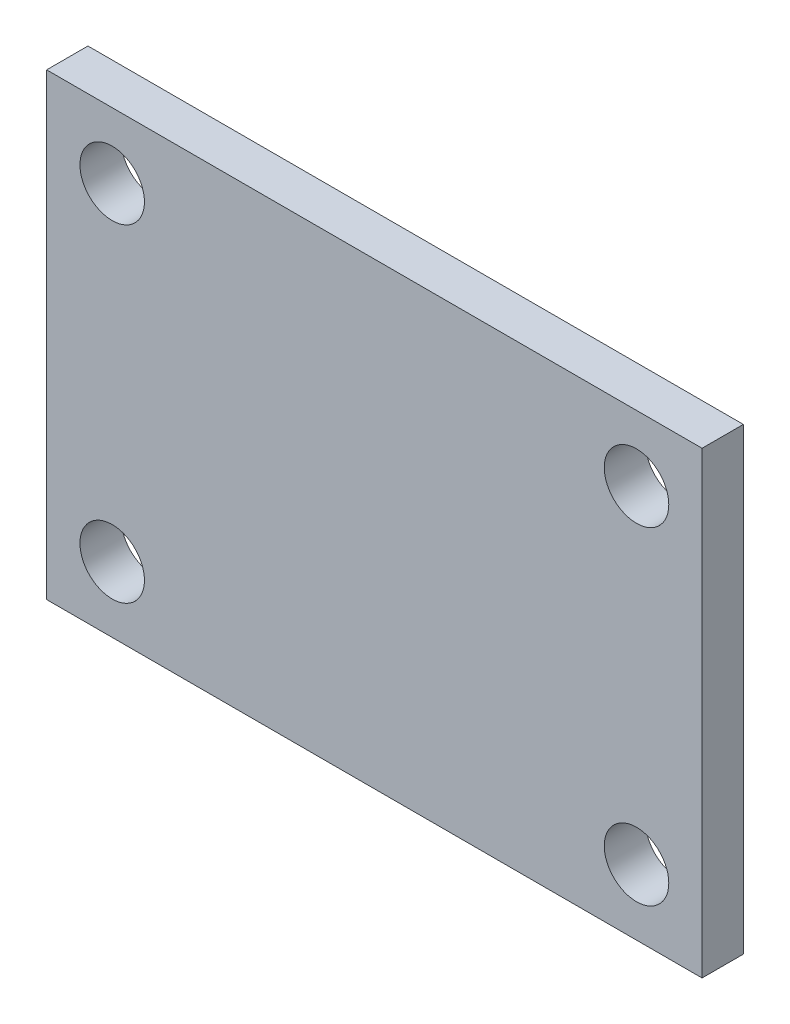
ISO-10303-21;
HEADER;
FILE_DESCRIPTION(('STEP AP214'),'2;1');
FILE_NAME('part.step','',(''),(''),'','','');
FILE_SCHEMA(('AUTOMOTIVE_DESIGN { 1 0 10303 214 1 1 1 1 }'));
ENDSEC;
DATA;
#1=APPLICATION_CONTEXT('core data for automotive mechanical design processes');
#2=APPLICATION_PROTOCOL_DEFINITION('international standard','automotive_design',2000,#1);
#3=PRODUCT_CONTEXT('',#1,'mechanical');
#4=PRODUCT('Part','Part','',(#3));
#5=PRODUCT_RELATED_PRODUCT_CATEGORY('part','',(#4));
#6=PRODUCT_DEFINITION_FORMATION('','',#4);
#7=PRODUCT_DEFINITION_CONTEXT('part definition',#1,'design');
#8=PRODUCT_DEFINITION('design','',#6,#7);
#9=PRODUCT_DEFINITION_SHAPE('','',#8);
#10=(LENGTH_UNIT() NAMED_UNIT(*) SI_UNIT(.MILLI.,.METRE.));
#11=(NAMED_UNIT(*) PLANE_ANGLE_UNIT() SI_UNIT($,.RADIAN.));
#12=(NAMED_UNIT(*) SI_UNIT($,.STERADIAN.) SOLID_ANGLE_UNIT());
#13=UNCERTAINTY_MEASURE_WITH_UNIT(LENGTH_MEASURE(1.E-05),#10,'distance_accuracy_value','');
#14=(GEOMETRIC_REPRESENTATION_CONTEXT(3) GLOBAL_UNCERTAINTY_ASSIGNED_CONTEXT((#13)) GLOBAL_UNIT_ASSIGNED_CONTEXT((#10,
#11,#12)) REPRESENTATION_CONTEXT('',''));
#15=CARTESIAN_POINT('',(0.,0.,0.));
#16=DIRECTION('',(0.,0.,1.));
#17=DIRECTION('',(1.,0.,0.));
#18=AXIS2_PLACEMENT_3D('',#15,#16,#17);
#19=CARTESIAN_POINT('',(0.,0.,-22.55));
#20=DIRECTION('',(0.,0.,-1.));
#21=DIRECTION('',(-1.,0.,0.));
#22=AXIS2_PLACEMENT_3D('',#19,#20,#21);
#23=PLANE('',#22);
#24=DIRECTION('',(0.,-1.,0.));
#25=VECTOR('',#24,1.);
#26=CARTESIAN_POINT('',(-0.2,-8.89,-22.55));
#27=LINE('',#26,#25);
#28=CARTESIAN_POINT('',(-0.2,8.89,-22.55));
#29=VERTEX_POINT('',#28);
#30=CARTESIAN_POINT('',(-0.2,-8.89,-22.55));
#31=VERTEX_POINT('',#30);
#32=EDGE_CURVE('E91',#29,#31,#27,.T.);
#33=ORIENTED_EDGE('',*,*,#32,.T.);
#34=DIRECTION('',(1.,0.,0.));
#35=VECTOR('',#34,1.);
#36=CARTESIAN_POINT('',(-0.2,-8.89,-22.55));
#37=LINE('',#36,#35);
#38=CARTESIAN_POINT('',(25.2,-8.89,-22.55));
#39=VERTEX_POINT('',#38);
#40=EDGE_CURVE('E86',#31,#39,#37,.T.);
#41=ORIENTED_EDGE('',*,*,#40,.T.);
#42=DIRECTION('',(0.,1.,0.));
#43=VECTOR('',#42,1.);
#44=CARTESIAN_POINT('',(25.2,-8.89,-22.55));
#45=LINE('',#44,#43);
#46=CARTESIAN_POINT('',(25.2,8.89,-22.55));
#47=VERTEX_POINT('',#46);
#48=EDGE_CURVE('E87',#39,#47,#45,.T.);
#49=ORIENTED_EDGE('',*,*,#48,.T.);
#50=DIRECTION('',(-1.,0.,0.));
#51=VECTOR('',#50,1.);
#52=CARTESIAN_POINT('',(-0.2,8.89,-22.55));
#53=LINE('',#52,#51);
#54=EDGE_CURVE('E57',#47,#29,#53,.T.);
#55=ORIENTED_EDGE('',*,*,#54,.T.);
#56=EDGE_LOOP('',(#33,#41,#49,#55));
#57=FACE_BOUND('',#56,.T.);
#58=CARTESIAN_POINT('',(2.34,6.35,-22.55));
#59=DIRECTION('',(0.,0.,1.));
#60=DIRECTION('',(1.,0.,0.));
#61=AXIS2_PLACEMENT_3D('',#58,#59,#60);
#62=CIRCLE('',#61,1.25);
#63=CARTESIAN_POINT('',(3.59,6.35,-22.55));
#64=VERTEX_POINT('',#63);
#65=EDGE_CURVE('E107',#64,#64,#62,.T.);
#66=ORIENTED_EDGE('',*,*,#65,.F.);
#67=EDGE_LOOP('',(#66));
#68=FACE_BOUND('',#67,.T.);
#69=CARTESIAN_POINT('',(22.66,6.35,-22.55));
#70=DIRECTION('',(0.,0.,1.));
#71=DIRECTION('',(1.,0.,0.));
#72=AXIS2_PLACEMENT_3D('',#69,#70,#71);
#73=CIRCLE('',#72,1.25);
#74=CARTESIAN_POINT('',(23.91,6.35,-22.55));
#75=VERTEX_POINT('',#74);
#76=EDGE_CURVE('E123',#75,#75,#73,.T.);
#77=ORIENTED_EDGE('',*,*,#76,.F.);
#78=EDGE_LOOP('',(#77));
#79=FACE_BOUND('',#78,.T.);
#80=CARTESIAN_POINT('',(2.34,-6.35,-22.55));
#81=DIRECTION('',(0.,0.,1.));
#82=DIRECTION('',(1.,0.,0.));
#83=AXIS2_PLACEMENT_3D('',#80,#81,#82);
#84=CIRCLE('',#83,1.25);
#85=CARTESIAN_POINT('',(3.59,-6.35,-22.55));
#86=VERTEX_POINT('',#85);
#87=EDGE_CURVE('E130',#86,#86,#84,.T.);
#88=ORIENTED_EDGE('',*,*,#87,.F.);
#89=EDGE_LOOP('',(#88));
#90=FACE_BOUND('',#89,.T.);
#91=CARTESIAN_POINT('',(22.66,-6.35,-22.55));
#92=DIRECTION('',(0.,0.,1.));
#93=DIRECTION('',(1.,0.,0.));
#94=AXIS2_PLACEMENT_3D('',#91,#92,#93);
#95=CIRCLE('',#94,1.25);
#96=CARTESIAN_POINT('',(23.91,-6.35,-22.55));
#97=VERTEX_POINT('',#96);
#98=EDGE_CURVE('E133',#97,#97,#95,.T.);
#99=ORIENTED_EDGE('',*,*,#98,.F.);
#100=EDGE_LOOP('',(#99));
#101=FACE_BOUND('',#100,.T.);
#102=ADVANCED_FACE('F39',(#57,#68,#79,#90,#101),#23,.F.);
#103=CARTESIAN_POINT('',(0.,0.,-24.15));
#104=DIRECTION('',(0.,0.,-1.));
#105=DIRECTION('',(-1.,0.,0.));
#106=AXIS2_PLACEMENT_3D('',#103,#104,#105);
#107=PLANE('',#106);
#108=CARTESIAN_POINT('',(2.34,-6.35,-24.15));
#109=DIRECTION('',(0.,0.,1.));
#110=DIRECTION('',(1.,0.,0.));
#111=AXIS2_PLACEMENT_3D('',#108,#109,#110);
#112=CIRCLE('',#111,1.25);
#113=CARTESIAN_POINT('',(3.59,-6.35,-24.15));
#114=VERTEX_POINT('',#113);
#115=EDGE_CURVE('E127',#114,#114,#112,.T.);
#116=ORIENTED_EDGE('',*,*,#115,.T.);
#117=EDGE_LOOP('',(#116));
#118=FACE_BOUND('',#117,.T.);
#119=CARTESIAN_POINT('',(2.34,6.35,-24.15));
#120=DIRECTION('',(0.,0.,1.));
#121=DIRECTION('',(1.,0.,0.));
#122=AXIS2_PLACEMENT_3D('',#119,#120,#121);
#123=CIRCLE('',#122,1.25);
#124=CARTESIAN_POINT('',(3.59,6.35,-24.15));
#125=VERTEX_POINT('',#124);
#126=EDGE_CURVE('E120',#125,#125,#123,.T.);
#127=ORIENTED_EDGE('',*,*,#126,.T.);
#128=EDGE_LOOP('',(#127));
#129=FACE_BOUND('',#128,.T.);
#130=DIRECTION('',(0.,-1.,0.));
#131=VECTOR('',#130,1.);
#132=CARTESIAN_POINT('',(-0.2,-8.89,-24.15));
#133=LINE('',#132,#131);
#134=CARTESIAN_POINT('',(-0.2,8.89,-24.15));
#135=VERTEX_POINT('',#134);
#136=CARTESIAN_POINT('',(-0.2,-8.89,-24.15));
#137=VERTEX_POINT('',#136);
#138=EDGE_CURVE('E104',#135,#137,#133,.T.);
#139=ORIENTED_EDGE('',*,*,#138,.F.);
#140=DIRECTION('',(-1.,0.,0.));
#141=VECTOR('',#140,1.);
#142=CARTESIAN_POINT('',(-0.2,8.89,-24.15));
#143=LINE('',#142,#141);
#144=CARTESIAN_POINT('',(25.2,8.89,-24.15));
#145=VERTEX_POINT('',#144);
#146=EDGE_CURVE('E80',#145,#135,#143,.T.);
#147=ORIENTED_EDGE('',*,*,#146,.F.);
#148=DIRECTION('',(0.,1.,0.));
#149=VECTOR('',#148,1.);
#150=CARTESIAN_POINT('',(25.2,-8.89,-24.15));
#151=LINE('',#150,#149);
#152=CARTESIAN_POINT('',(25.2,-8.89,-24.15));
#153=VERTEX_POINT('',#152);
#154=EDGE_CURVE('E75',#153,#145,#151,.T.);
#155=ORIENTED_EDGE('',*,*,#154,.F.);
#156=DIRECTION('',(1.,0.,0.));
#157=VECTOR('',#156,1.);
#158=CARTESIAN_POINT('',(-0.2,-8.89,-24.15));
#159=LINE('',#158,#157);
#160=EDGE_CURVE('E94',#137,#153,#159,.T.);
#161=ORIENTED_EDGE('',*,*,#160,.F.);
#162=EDGE_LOOP('',(#139,#147,#155,#161));
#163=FACE_BOUND('',#162,.T.);
#164=CARTESIAN_POINT('',(22.66,6.35,-24.15));
#165=DIRECTION('',(0.,0.,1.));
#166=DIRECTION('',(1.,0.,0.));
#167=AXIS2_PLACEMENT_3D('',#164,#165,#166);
#168=CIRCLE('',#167,1.25);
#169=CARTESIAN_POINT('',(23.91,6.35,-24.15));
#170=VERTEX_POINT('',#169);
#171=EDGE_CURVE('E125',#170,#170,#168,.T.);
#172=ORIENTED_EDGE('',*,*,#171,.T.);
#173=EDGE_LOOP('',(#172));
#174=FACE_BOUND('',#173,.T.);
#175=CARTESIAN_POINT('',(22.66,-6.35,-24.15));
#176=DIRECTION('',(0.,0.,1.));
#177=DIRECTION('',(1.,0.,0.));
#178=AXIS2_PLACEMENT_3D('',#175,#176,#177);
#179=CIRCLE('',#178,1.25);
#180=CARTESIAN_POINT('',(23.91,-6.35,-24.15));
#181=VERTEX_POINT('',#180);
#182=EDGE_CURVE('E136',#181,#181,#179,.T.);
#183=ORIENTED_EDGE('',*,*,#182,.T.);
#184=EDGE_LOOP('',(#183));
#185=FACE_BOUND('',#184,.T.);
#186=ADVANCED_FACE('F114',(#118,#129,#163,#174,#185),#107,.T.);
#187=CARTESIAN_POINT('',(-0.2,-8.89,-22.55));
#188=DIRECTION('',(1.,0.,0.));
#189=DIRECTION('',(0.,0.,-1.));
#190=AXIS2_PLACEMENT_3D('',#187,#188,#189);
#191=PLANE('',#190);
#192=ORIENTED_EDGE('',*,*,#138,.T.);
#193=DIRECTION('',(0.,0.,-1.));
#194=VECTOR('',#193,1.);
#195=CARTESIAN_POINT('',(-0.2,-8.89,-22.55));
#196=LINE('',#195,#194);
#197=EDGE_CURVE('E11',#31,#137,#196,.T.);
#198=ORIENTED_EDGE('',*,*,#197,.F.);
#199=ORIENTED_EDGE('',*,*,#32,.F.);
#200=DIRECTION('',(0.,0.,-1.));
#201=VECTOR('',#200,1.);
#202=CARTESIAN_POINT('',(-0.2,8.89,-22.55));
#203=LINE('',#202,#201);
#204=EDGE_CURVE('E98',#29,#135,#203,.T.);
#205=ORIENTED_EDGE('',*,*,#204,.T.);
#206=EDGE_LOOP('',(#192,#198,#199,#205));
#207=FACE_BOUND('',#206,.T.);
#208=ADVANCED_FACE('F41',(#207),#191,.F.);
#209=CARTESIAN_POINT('',(-0.2,-8.89,-22.55));
#210=DIRECTION('',(0.,1.,0.));
#211=DIRECTION('',(0.,0.,1.));
#212=AXIS2_PLACEMENT_3D('',#209,#210,#211);
#213=PLANE('',#212);
#214=ORIENTED_EDGE('',*,*,#160,.T.);
#215=DIRECTION('',(0.,0.,-1.));
#216=VECTOR('',#215,1.);
#217=CARTESIAN_POINT('',(25.2,-8.89,-22.55));
#218=LINE('',#217,#216);
#219=EDGE_CURVE('E48',#39,#153,#218,.T.);
#220=ORIENTED_EDGE('',*,*,#219,.F.);
#221=ORIENTED_EDGE('',*,*,#40,.F.);
#222=ORIENTED_EDGE('',*,*,#197,.T.);
#223=EDGE_LOOP('',(#214,#220,#221,#222));
#224=FACE_BOUND('',#223,.T.);
#225=ADVANCED_FACE('F92',(#224),#213,.F.);
#226=CARTESIAN_POINT('',(25.2,-8.89,-22.55));
#227=DIRECTION('',(-1.,0.,0.));
#228=DIRECTION('',(0.,0.,1.));
#229=AXIS2_PLACEMENT_3D('',#226,#227,#228);
#230=PLANE('',#229);
#231=ORIENTED_EDGE('',*,*,#154,.T.);
#232=DIRECTION('',(0.,0.,-1.));
#233=VECTOR('',#232,1.);
#234=CARTESIAN_POINT('',(25.2,8.89,-22.55));
#235=LINE('',#234,#233);
#236=EDGE_CURVE('E96',#47,#145,#235,.T.);
#237=ORIENTED_EDGE('',*,*,#236,.F.);
#238=ORIENTED_EDGE('',*,*,#48,.F.);
#239=ORIENTED_EDGE('',*,*,#219,.T.);
#240=EDGE_LOOP('',(#231,#237,#238,#239));
#241=FACE_BOUND('',#240,.T.);
#242=ADVANCED_FACE('F100',(#241),#230,.F.);
#243=CARTESIAN_POINT('',(-0.2,8.89,-22.55));
#244=DIRECTION('',(0.,-1.,0.));
#245=DIRECTION('',(0.,0.,-1.));
#246=AXIS2_PLACEMENT_3D('',#243,#244,#245);
#247=PLANE('',#246);
#248=ORIENTED_EDGE('',*,*,#146,.T.);
#249=ORIENTED_EDGE('',*,*,#204,.F.);
#250=ORIENTED_EDGE('',*,*,#54,.F.);
#251=ORIENTED_EDGE('',*,*,#236,.T.);
#252=EDGE_LOOP('',(#248,#249,#250,#251));
#253=FACE_BOUND('',#252,.T.);
#254=ADVANCED_FACE('F112',(#253),#247,.F.);
#255=CARTESIAN_POINT('',(2.34,6.35,-22.55));
#256=DIRECTION('',(0.,0.,-1.));
#257=DIRECTION('',(-1.,0.,0.));
#258=AXIS2_PLACEMENT_3D('',#255,#256,#257);
#259=CYLINDRICAL_SURFACE('',#258,1.25);
#260=ORIENTED_EDGE('',*,*,#65,.T.);
#261=EDGE_LOOP('',(#260));
#262=FACE_BOUND('',#261,.T.);
#263=ORIENTED_EDGE('',*,*,#126,.F.);
#264=EDGE_LOOP('',(#263));
#265=FACE_BOUND('',#264,.T.);
#266=ADVANCED_FACE('F155',(#262,#265),#259,.F.);
#267=CARTESIAN_POINT('',(22.66,6.35,-22.55));
#268=DIRECTION('',(0.,0.,-1.));
#269=DIRECTION('',(-1.,0.,0.));
#270=AXIS2_PLACEMENT_3D('',#267,#268,#269);
#271=CYLINDRICAL_SURFACE('',#270,1.25);
#272=ORIENTED_EDGE('',*,*,#76,.T.);
#273=EDGE_LOOP('',(#272));
#274=FACE_BOUND('',#273,.T.);
#275=ORIENTED_EDGE('',*,*,#171,.F.);
#276=EDGE_LOOP('',(#275));
#277=FACE_BOUND('',#276,.T.);
#278=ADVANCED_FACE('F200',(#274,#277),#271,.F.);
#279=CARTESIAN_POINT('',(2.34,-6.35,-22.55));
#280=DIRECTION('',(0.,0.,-1.));
#281=DIRECTION('',(-1.,0.,0.));
#282=AXIS2_PLACEMENT_3D('',#279,#280,#281);
#283=CYLINDRICAL_SURFACE('',#282,1.25);
#284=ORIENTED_EDGE('',*,*,#87,.T.);
#285=EDGE_LOOP('',(#284));
#286=FACE_BOUND('',#285,.T.);
#287=ORIENTED_EDGE('',*,*,#115,.F.);
#288=EDGE_LOOP('',(#287));
#289=FACE_BOUND('',#288,.T.);
#290=ADVANCED_FACE('F207',(#286,#289),#283,.F.);
#291=CARTESIAN_POINT('',(22.66,-6.35,-22.55));
#292=DIRECTION('',(0.,0.,-1.));
#293=DIRECTION('',(-1.,0.,0.));
#294=AXIS2_PLACEMENT_3D('',#291,#292,#293);
#295=CYLINDRICAL_SURFACE('',#294,1.25);
#296=ORIENTED_EDGE('',*,*,#98,.T.);
#297=EDGE_LOOP('',(#296));
#298=FACE_BOUND('',#297,.T.);
#299=ORIENTED_EDGE('',*,*,#182,.F.);
#300=EDGE_LOOP('',(#299));
#301=FACE_BOUND('',#300,.T.);
#302=ADVANCED_FACE('F145',(#298,#301),#295,.F.);
#303=CLOSED_SHELL('',(#102,#186,#208,#225,#242,#254,#266,#278,#290,#302));
#304=MANIFOLD_SOLID_BREP('B2',#303);
#305=ADVANCED_BREP_SHAPE_REPRESENTATION('',(#18,#304),#14);
#306=SHAPE_DEFINITION_REPRESENTATION(#9,#305);
ENDSEC;
END-ISO-10303-21;
